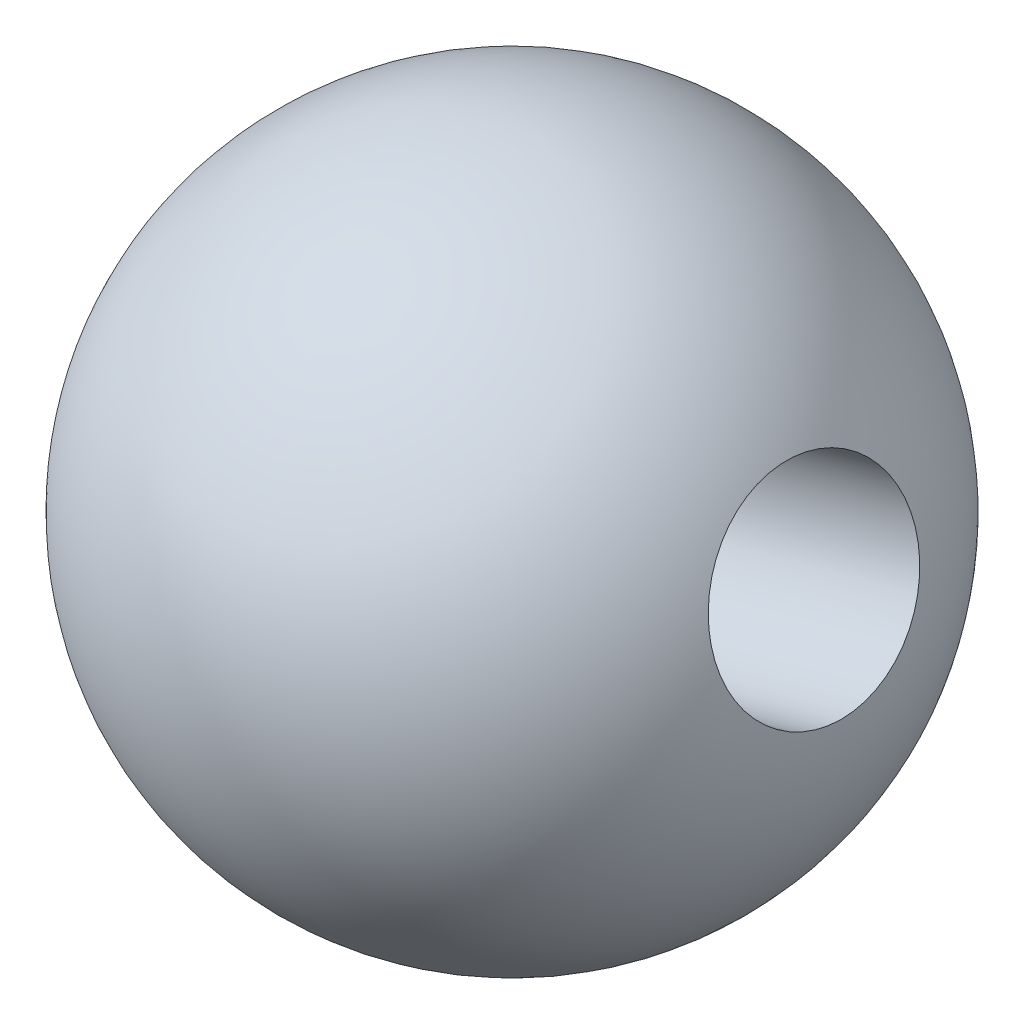
ISO-10303-21;
HEADER;
FILE_DESCRIPTION(('STEP AP214'),'2;1');
FILE_NAME('part.step','',(''),(''),'','','');
FILE_SCHEMA(('AUTOMOTIVE_DESIGN { 1 0 10303 214 1 1 1 1 }'));
ENDSEC;
DATA;
#1=APPLICATION_CONTEXT('core data for automotive mechanical design processes');
#2=APPLICATION_PROTOCOL_DEFINITION('international standard','automotive_design',2000,#1);
#3=PRODUCT_CONTEXT('',#1,'mechanical');
#4=PRODUCT('Part','Part','',(#3));
#5=PRODUCT_RELATED_PRODUCT_CATEGORY('part','',(#4));
#6=PRODUCT_DEFINITION_FORMATION('','',#4);
#7=PRODUCT_DEFINITION_CONTEXT('part definition',#1,'design');
#8=PRODUCT_DEFINITION('design','',#6,#7);
#9=PRODUCT_DEFINITION_SHAPE('','',#8);
#10=(LENGTH_UNIT() NAMED_UNIT(*) SI_UNIT(.MILLI.,.METRE.));
#11=(NAMED_UNIT(*) PLANE_ANGLE_UNIT() SI_UNIT($,.RADIAN.));
#12=(NAMED_UNIT(*) SI_UNIT($,.STERADIAN.) SOLID_ANGLE_UNIT());
#13=UNCERTAINTY_MEASURE_WITH_UNIT(LENGTH_MEASURE(1.E-05),#10,'distance_accuracy_value','');
#14=(GEOMETRIC_REPRESENTATION_CONTEXT(3) GLOBAL_UNCERTAINTY_ASSIGNED_CONTEXT((#13)) GLOBAL_UNIT_ASSIGNED_CONTEXT((#10,
#11,#12)) REPRESENTATION_CONTEXT('',''));
#15=CARTESIAN_POINT('',(0.,0.,0.));
#16=DIRECTION('',(0.,0.,1.));
#17=DIRECTION('',(1.,0.,0.));
#18=AXIS2_PLACEMENT_3D('',#15,#16,#17);
#19=CARTESIAN_POINT('',(-77.7141127856753,-35.5403552439463,44.795));
#20=DIRECTION('',(-0.266759665910697,0.963763083253978,0.));
#21=DIRECTION('',(0.,0.,-1.));
#22=AXIS2_PLACEMENT_3D('',#19,#20,#21);
#23=SPHERICAL_SURFACE('',#22,10.);
#24=CARTESIAN_POINT('',(-77.7141127856753,-35.5403552439463,44.795));
#25=DIRECTION('',(-0.963763083253978,-0.266759665910697,0.));
#26=DIRECTION('',(0.266759665910697,-0.963763083253978,0.));
#27=AXIS2_PLACEMENT_3D('',#24,#25,#26);
#28=SPHERICAL_SURFACE('',#27,10.);
#29=CARTESIAN_POINT('',(-68.5512648344464,-33.0041735819473,44.795));
#30=DIRECTION('',(-0.963763083253977,-0.266759665910697,0.));
#31=DIRECTION('',(0.266759665910697,-0.963763083253978,0.));
#32=AXIS2_PLACEMENT_3D('',#29,#30,#31);
#33=CIRCLE('',#32,3.1);
#34=CARTESIAN_POINT('',(-67.7243098701233,-35.9918391400347,44.795));
#35=VERTEX_POINT('',#34);
#36=EDGE_CURVE('E10',#35,#35,#33,.T.);
#37=ORIENTED_EDGE('',*,*,#36,.T.);
#38=EDGE_LOOP('',(#37));
#39=FACE_BOUND('',#38,.T.);
#40=ADVANCED_FACE('F40',(#39),#28,.T.);
#41=CARTESIAN_POINT('',(-65.8547887981843,-32.2578168693195,44.795));
#42=DIRECTION('',(-0.963763083253977,-0.266759665910697,0.));
#43=DIRECTION('',(0.266759665910697,-0.963763083253978,0.));
#44=AXIS2_PLACEMENT_3D('',#41,#42,#43);
#45=CYLINDRICAL_SURFACE('',#44,3.1);
#46=CARTESIAN_POINT('',(-77.7141127856753,-35.5403552439463,44.795));
#47=DIRECTION('',(-0.963763083253977,-0.266759665910697,0.));
#48=DIRECTION('',(0.266759665910697,-0.963763083253978,0.));
#49=AXIS2_PLACEMENT_3D('',#46,#47,#48);
#50=CIRCLE('',#49,3.1);
#51=CARTESIAN_POINT('',(-76.8871578213522,-38.5280208020337,44.795));
#52=VERTEX_POINT('',#51);
#53=EDGE_CURVE('E43',#52,#52,#50,.T.);
#54=CARTESIAN_POINT('',(-76.8871578213522,-38.5280208020337,44.795));
#55=CARTESIAN_POINT('',(-76.7917114885269,-38.5016022430545,44.795));
#56=CARTESIAN_POINT('',(-76.6962651557016,-38.4751836840754,44.795));
#57=CARTESIAN_POINT('',(-76.505372490051,-38.422346566117,44.795));
#58=CARTESIAN_POINT('',(-76.4099261572257,-38.3959280071379,44.795));
#59=CARTESIAN_POINT('',(-76.2190334915751,-38.3430908891796,44.795));
#60=CARTESIAN_POINT('',(-76.1235871587498,-38.3166723302004,44.795));
#61=CARTESIAN_POINT('',(-75.9326944930992,-38.2638352122421,44.795));
#62=CARTESIAN_POINT('',(-75.8372481602739,-38.237416653263,44.795));
#63=CARTESIAN_POINT('',(-75.6463554946233,-38.1845795353046,44.795));
#64=CARTESIAN_POINT('',(-75.550909161798,-38.1581609763255,44.795));
#65=CARTESIAN_POINT('',(-75.3600164961474,-38.1053238583672,44.795));
#66=CARTESIAN_POINT('',(-75.2645701633221,-38.078905299388,44.795));
#67=CARTESIAN_POINT('',(-75.0736774976715,-38.0260681814297,44.795));
#68=CARTESIAN_POINT('',(-74.9782311648462,-37.9996496224505,44.795));
#69=CARTESIAN_POINT('',(-74.7873384991956,-37.9468125044922,44.795));
#70=CARTESIAN_POINT('',(-74.6918921663703,-37.9203939455131,44.795));
#71=CARTESIAN_POINT('',(-74.5009995007197,-37.8675568275548,44.795));
#72=CARTESIAN_POINT('',(-74.4055531678944,-37.8411382685756,44.795));
#73=CARTESIAN_POINT('',(-74.2146605022437,-37.7883011506173,44.795));
#74=CARTESIAN_POINT('',(-74.1192141694185,-37.7618825916381,44.795));
#75=CARTESIAN_POINT('',(-73.9283215037678,-37.7090454736798,44.795));
#76=CARTESIAN_POINT('',(-73.8328751709425,-37.6826269147007,44.795));
#77=CARTESIAN_POINT('',(-73.6419825052919,-37.6297897967424,44.795));
#78=CARTESIAN_POINT('',(-73.5465361724666,-37.6033712377632,44.795));
#79=CARTESIAN_POINT('',(-73.3556435068161,-37.5505341198049,44.795));
#80=CARTESIAN_POINT('',(-73.2601971739907,-37.5241155608257,44.795));
#81=CARTESIAN_POINT('',(-73.0693045083401,-37.4712784428674,44.795));
#82=CARTESIAN_POINT('',(-72.9738581755148,-37.4448598838883,44.795));
#83=CARTESIAN_POINT('',(-72.7829655098642,-37.39202276593,44.795));
#84=CARTESIAN_POINT('',(-72.6875191770389,-37.3656042069508,44.795));
#85=CARTESIAN_POINT('',(-72.4966265113883,-37.3127670889925,44.795));
#86=CARTESIAN_POINT('',(-72.401180178563,-37.2863485300133,44.795));
#87=CARTESIAN_POINT('',(-72.2102875129124,-37.233511412055,44.795));
#88=CARTESIAN_POINT('',(-72.1148411800871,-37.2070928530759,44.795));
#89=CARTESIAN_POINT('',(-71.9239485144365,-37.1542557351175,44.795));
#90=CARTESIAN_POINT('',(-71.8285021816112,-37.1278371761384,44.795));
#91=CARTESIAN_POINT('',(-71.6376095159606,-37.0750000581801,44.795));
#92=CARTESIAN_POINT('',(-71.5421631831353,-37.0485814992009,44.795));
#93=CARTESIAN_POINT('',(-71.3512705174847,-36.9957443812426,44.795));
#94=CARTESIAN_POINT('',(-71.2558241846594,-36.9693258222635,44.795));
#95=CARTESIAN_POINT('',(-71.0649315190088,-36.9164887043051,44.795));
#96=CARTESIAN_POINT('',(-70.9694851861835,-36.890070145326,44.795));
#97=CARTESIAN_POINT('',(-70.7785925205329,-36.8372330273677,44.795));
#98=CARTESIAN_POINT('',(-70.6831461877076,-36.8108144683885,44.795));
#99=CARTESIAN_POINT('',(-70.492253522057,-36.7579773504302,44.795));
#100=CARTESIAN_POINT('',(-70.3968071892317,-36.7315587914511,44.795));
#101=CARTESIAN_POINT('',(-70.2059145235811,-36.6787216734927,44.795));
#102=CARTESIAN_POINT('',(-70.1104681907558,-36.6523031145136,44.795));
#103=CARTESIAN_POINT('',(-69.9195755251052,-36.5994659965553,44.795));
#104=CARTESIAN_POINT('',(-69.8241291922799,-36.5730474375761,44.795));
#105=CARTESIAN_POINT('',(-69.6332365266293,-36.5202103196178,44.795));
#106=CARTESIAN_POINT('',(-69.537790193804,-36.4937917606386,44.795));
#107=CARTESIAN_POINT('',(-69.3468975281534,-36.4409546426803,44.795));
#108=CARTESIAN_POINT('',(-69.2514511953281,-36.4145360837012,44.795));
#109=CARTESIAN_POINT('',(-69.0605585296775,-36.3616989657429,44.795));
#110=CARTESIAN_POINT('',(-68.9651121968522,-36.3352804067637,44.795));
#111=CARTESIAN_POINT('',(-68.7742195312016,-36.2824432888054,44.795));
#112=CARTESIAN_POINT('',(-68.6787731983763,-36.2560247298262,44.795));
#113=CARTESIAN_POINT('',(-68.4878805327257,-36.2031876118679,44.795));
#114=CARTESIAN_POINT('',(-68.3924341999004,-36.1767690528888,44.795));
#115=CARTESIAN_POINT('',(-68.2015415342498,-36.1239319349305,44.795));
#116=CARTESIAN_POINT('',(-68.1060952014245,-36.0975133759513,44.795));
#117=CARTESIAN_POINT('',(-67.9152025357739,-36.044676257993,44.795));
#118=CARTESIAN_POINT('',(-67.8197562029486,-36.0182576990138,44.795));
#119=CARTESIAN_POINT('',(-67.7243098701233,-35.9918391400347,44.795));
#120=B_SPLINE_CURVE_WITH_KNOTS('',3,(#54,#55,#56,#57,#58,#59,#60,#61,#62,#63,#64,#65,#66,#67,
#68,#69,#70,#71,#72,#73,#74,#75,#76,#77,#78,#79,#80,#81,#82,#83,#84,#85,#86,#87,#88,#89,#90,#91,
#92,#93,#94,#95,#96,#97,#98,#99,#100,#101,#102,#103,#104,#105,#106,#107,#108,#109,#110,#111,
#112,#113,#114,#115,#116,#117,#118,#119),.UNSPECIFIED.,.F.,.F.,(4,2,2,2,2,2,2,2,2,2,2,2,2,2,2,2,
2,2,2,2,2,2,2,2,2,2,2,2,2,2,2,2,4),(0.,0.297105173928352,0.594210347856717,0.891315521785067,
1.18842069571343,1.48552586964178,1.78263104357015,2.0797362174985,2.37684139142686,
2.67394656535521,2.97105173928358,3.26815691321193,3.56526208714029,3.86236726106864,
4.15947243499701,4.45657760892536,4.75368278285372,5.05078795678209,5.34789313071044,
5.64499830463881,5.94210347856715,6.23920865249552,6.53631382642387,6.83341900035223,
7.13052417428058,7.42762934820895,7.7247345221373,8.02183969606566,8.31894486999401,
8.61605004392238,8.91315521785073,9.21026039177909,9.50736556570745),.UNSPECIFIED.);
#121=EDGE_CURVE('BSEAM47',#52,#35,#120,.T.);
#122=ORIENTED_EDGE('',*,*,#53,.T.);
#123=ORIENTED_EDGE('',*,*,#36,.F.);
#124=ORIENTED_EDGE('',*,*,#121,.T.);
#125=ORIENTED_EDGE('',*,*,#121,.F.);
#126=EDGE_LOOP('',(#122,#124,#123,#125));
#127=FACE_BOUND('',#126,.T.);
#128=ADVANCED_FACE('F47',(#127),#45,.F.);
#129=CARTESIAN_POINT('',(-77.7141127856753,-35.5403552439463,44.795));
#130=DIRECTION('',(-0.963763083253977,-0.266759665910697,0.));
#131=DIRECTION('',(0.266759665910697,-0.963763083253978,0.));
#132=AXIS2_PLACEMENT_3D('',#129,#130,#131);
#133=PLANE('',#132);
#134=ORIENTED_EDGE('',*,*,#53,.F.);
#135=EDGE_LOOP('',(#134));
#136=FACE_BOUND('',#135,.T.);
#137=ADVANCED_FACE('F55',(#136),#133,.F.);
#138=CLOSED_SHELL('',(#40,#128,#137));
#139=MANIFOLD_SOLID_BREP('B2',#138);
#140=ADVANCED_BREP_SHAPE_REPRESENTATION('',(#18,#139),#14);
#141=SHAPE_DEFINITION_REPRESENTATION(#9,#140);
ENDSEC;
END-ISO-10303-21;
